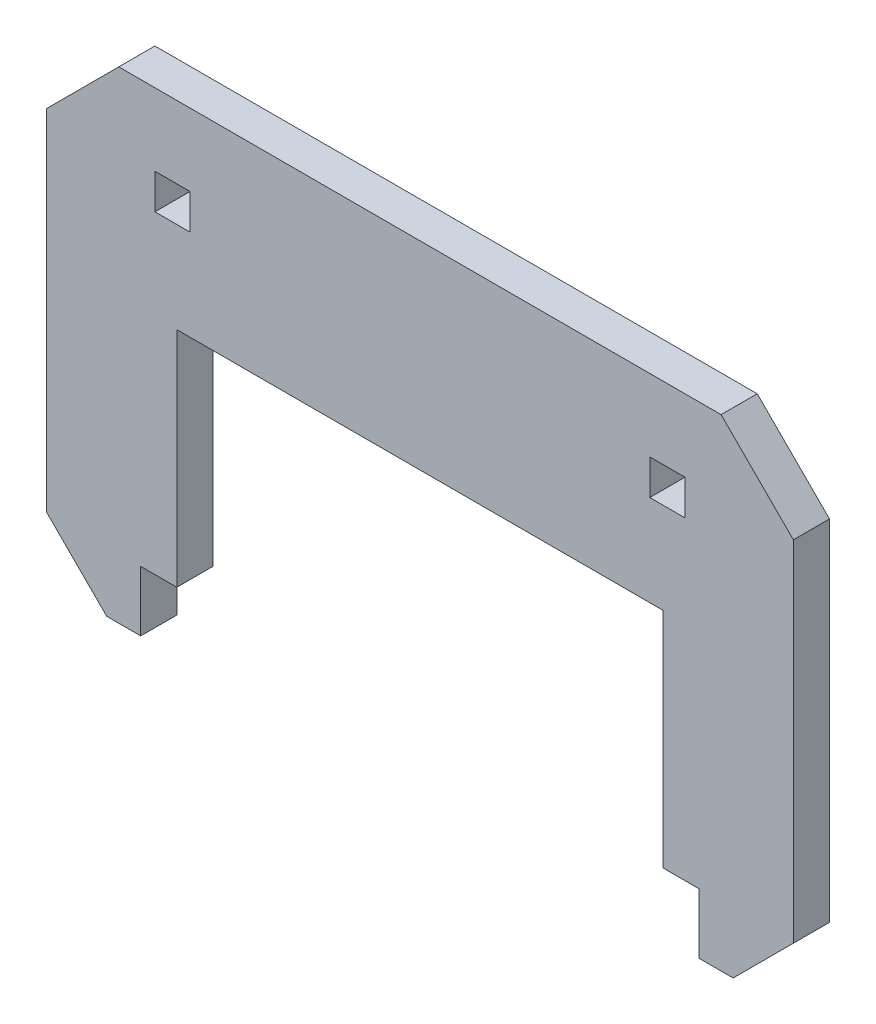
ISO-10303-21;
HEADER;
FILE_DESCRIPTION(('STEP AP214'),'2;1');
FILE_NAME('part.step','',(''),(''),'','','');
FILE_SCHEMA(('AUTOMOTIVE_DESIGN { 1 0 10303 214 1 1 1 1 }'));
ENDSEC;
DATA;
#1=APPLICATION_CONTEXT('core data for automotive mechanical design processes');
#2=APPLICATION_PROTOCOL_DEFINITION('international standard','automotive_design',2000,#1);
#3=PRODUCT_CONTEXT('',#1,'mechanical');
#4=PRODUCT('Part','Part','',(#3));
#5=PRODUCT_RELATED_PRODUCT_CATEGORY('part','',(#4));
#6=PRODUCT_DEFINITION_FORMATION('','',#4);
#7=PRODUCT_DEFINITION_CONTEXT('part definition',#1,'design');
#8=PRODUCT_DEFINITION('design','',#6,#7);
#9=PRODUCT_DEFINITION_SHAPE('','',#8);
#10=(LENGTH_UNIT() NAMED_UNIT(*) SI_UNIT(.MILLI.,.METRE.));
#11=(NAMED_UNIT(*) PLANE_ANGLE_UNIT() SI_UNIT($,.RADIAN.));
#12=(NAMED_UNIT(*) SI_UNIT($,.STERADIAN.) SOLID_ANGLE_UNIT());
#13=UNCERTAINTY_MEASURE_WITH_UNIT(LENGTH_MEASURE(1.E-05),#10,'distance_accuracy_value','');
#14=(GEOMETRIC_REPRESENTATION_CONTEXT(3) GLOBAL_UNCERTAINTY_ASSIGNED_CONTEXT((#13)) GLOBAL_UNIT_ASSIGNED_CONTEXT((#10,
#11,#12)) REPRESENTATION_CONTEXT('',''));
#15=CARTESIAN_POINT('',(0.,0.,0.));
#16=DIRECTION('',(0.,0.,1.));
#17=DIRECTION('',(1.,0.,0.));
#18=AXIS2_PLACEMENT_3D('',#15,#16,#17);
#19=CARTESIAN_POINT('',(-27.163730890987,-27.163730890987,3.));
#20=DIRECTION('',(0.707106781186548,0.707106781186547,0.));
#21=DIRECTION('',(-0.707106781186547,0.707106781186548,0.));
#22=AXIS2_PLACEMENT_3D('',#19,#20,#21);
#23=PLANE('',#22);
#24=DIRECTION('',(0.707106781186547,-0.707106781186548,0.));
#25=VECTOR('',#24,1.);
#26=CARTESIAN_POINT('',(-27.163730890987,-27.163730890987,0.));
#27=LINE('',#26,#25);
#28=CARTESIAN_POINT('',(-33.8654298148776,-20.4620319670965,0.));
#29=VERTEX_POINT('',#28);
#30=CARTESIAN_POINT('',(-28.8654298148776,-25.4620319670965,0.));
#31=VERTEX_POINT('',#30);
#32=EDGE_CURVE('E258',#29,#31,#27,.T.);
#33=ORIENTED_EDGE('',*,*,#32,.T.);
#34=DIRECTION('',(0.,0.,-1.));
#35=VECTOR('',#34,1.);
#36=CARTESIAN_POINT('',(-28.8654298148776,-25.4620319670965,3.));
#37=LINE('',#36,#35);
#38=CARTESIAN_POINT('',(-28.8654298148776,-25.4620319670965,3.));
#39=VERTEX_POINT('',#38);
#40=EDGE_CURVE('E11',#39,#31,#37,.T.);
#41=ORIENTED_EDGE('',*,*,#40,.F.);
#42=DIRECTION('',(0.707106781186547,-0.707106781186548,0.));
#43=VECTOR('',#42,1.);
#44=CARTESIAN_POINT('',(-27.163730890987,-27.163730890987,3.));
#45=LINE('',#44,#43);
#46=CARTESIAN_POINT('',(-33.8654298148776,-20.4620319670965,3.));
#47=VERTEX_POINT('',#46);
#48=EDGE_CURVE('E495',#47,#39,#45,.T.);
#49=ORIENTED_EDGE('',*,*,#48,.F.);
#50=DIRECTION('',(0.,0.,-1.));
#51=VECTOR('',#50,1.);
#52=CARTESIAN_POINT('',(-33.8654298148776,-20.4620319670965,3.));
#53=LINE('',#52,#51);
#54=EDGE_CURVE('E297',#47,#29,#53,.T.);
#55=ORIENTED_EDGE('',*,*,#54,.T.);
#56=EDGE_LOOP('',(#33,#41,#49,#55));
#57=FACE_BOUND('',#56,.T.);
#58=ADVANCED_FACE('F35',(#57),#23,.F.);
#59=CARTESIAN_POINT('',(0.,-25.4620319670965,3.));
#60=DIRECTION('',(0.,1.,0.));
#61=DIRECTION('',(0.,0.,1.));
#62=AXIS2_PLACEMENT_3D('',#59,#60,#61);
#63=PLANE('',#62);
#64=DIRECTION('',(1.,0.,0.));
#65=VECTOR('',#64,1.);
#66=CARTESIAN_POINT('',(0.,-25.4620319670965,0.));
#67=LINE('',#66,#65);
#68=CARTESIAN_POINT('',(-26.0454298148776,-25.4620319670965,0.));
#69=VERTEX_POINT('',#68);
#70=EDGE_CURVE('E261',#31,#69,#67,.T.);
#71=ORIENTED_EDGE('',*,*,#70,.T.);
#72=DIRECTION('',(0.,0.,-1.));
#73=VECTOR('',#72,1.);
#74=CARTESIAN_POINT('',(-26.0454298148776,-25.4620319670965,3.));
#75=LINE('',#74,#73);
#76=CARTESIAN_POINT('',(-26.0454298148776,-25.4620319670965,3.));
#77=VERTEX_POINT('',#76);
#78=EDGE_CURVE('E45',#77,#69,#75,.T.);
#79=ORIENTED_EDGE('',*,*,#78,.F.);
#80=DIRECTION('',(1.,0.,0.));
#81=VECTOR('',#80,1.);
#82=CARTESIAN_POINT('',(0.,-25.4620319670965,3.));
#83=LINE('',#82,#81);
#84=EDGE_CURVE('E496',#39,#77,#83,.T.);
#85=ORIENTED_EDGE('',*,*,#84,.F.);
#86=ORIENTED_EDGE('',*,*,#40,.T.);
#87=EDGE_LOOP('',(#71,#79,#85,#86));
#88=FACE_BOUND('',#87,.T.);
#89=ADVANCED_FACE('F368',(#88),#63,.F.);
#90=CARTESIAN_POINT('',(-26.0454298148776,0.,3.));
#91=DIRECTION('',(-1.,0.,0.));
#92=DIRECTION('',(0.,0.,1.));
#93=AXIS2_PLACEMENT_3D('',#90,#91,#92);
#94=PLANE('',#93);
#95=DIRECTION('',(0.,1.,0.));
#96=VECTOR('',#95,1.);
#97=CARTESIAN_POINT('',(-26.0454298148776,0.,0.));
#98=LINE('',#97,#96);
#99=CARTESIAN_POINT('',(-26.0454298148776,-20.4620319670965,0.));
#100=VERTEX_POINT('',#99);
#101=EDGE_CURVE('E263',#69,#100,#98,.T.);
#102=ORIENTED_EDGE('',*,*,#101,.T.);
#103=DIRECTION('',(0.,0.,-1.));
#104=VECTOR('',#103,1.);
#105=CARTESIAN_POINT('',(-26.0454298148776,-20.4620319670965,3.));
#106=LINE('',#105,#104);
#107=CARTESIAN_POINT('',(-26.0454298148776,-20.4620319670965,3.));
#108=VERTEX_POINT('',#107);
#109=EDGE_CURVE('E322',#108,#100,#106,.T.);
#110=ORIENTED_EDGE('',*,*,#109,.F.);
#111=DIRECTION('',(0.,1.,0.));
#112=VECTOR('',#111,1.);
#113=CARTESIAN_POINT('',(-26.0454298148776,0.,3.));
#114=LINE('',#113,#112);
#115=EDGE_CURVE('E499',#77,#108,#114,.T.);
#116=ORIENTED_EDGE('',*,*,#115,.F.);
#117=ORIENTED_EDGE('',*,*,#78,.T.);
#118=EDGE_LOOP('',(#102,#110,#116,#117));
#119=FACE_BOUND('',#118,.T.);
#120=ADVANCED_FACE('F374',(#119),#94,.F.);
#121=CARTESIAN_POINT('',(0.,-20.4620319670965,3.));
#122=DIRECTION('',(0.,1.,0.));
#123=DIRECTION('',(0.,0.,1.));
#124=AXIS2_PLACEMENT_3D('',#121,#122,#123);
#125=PLANE('',#124);
#126=DIRECTION('',(1.,0.,0.));
#127=VECTOR('',#126,1.);
#128=CARTESIAN_POINT('',(0.,-20.4620319670965,0.));
#129=LINE('',#128,#127);
#130=CARTESIAN_POINT('',(-23.0454298148776,-20.4620319670965,0.));
#131=VERTEX_POINT('',#130);
#132=EDGE_CURVE('E265',#100,#131,#129,.T.);
#133=ORIENTED_EDGE('',*,*,#132,.T.);
#134=DIRECTION('',(0.,0.,-1.));
#135=VECTOR('',#134,1.);
#136=CARTESIAN_POINT('',(-23.0454298148776,-20.4620319670965,3.));
#137=LINE('',#136,#135);
#138=CARTESIAN_POINT('',(-23.0454298148776,-20.4620319670965,3.));
#139=VERTEX_POINT('',#138);
#140=EDGE_CURVE('E319',#139,#131,#137,.T.);
#141=ORIENTED_EDGE('',*,*,#140,.F.);
#142=DIRECTION('',(1.,0.,0.));
#143=VECTOR('',#142,1.);
#144=CARTESIAN_POINT('',(0.,-20.4620319670965,3.));
#145=LINE('',#144,#143);
#146=EDGE_CURVE('E458',#108,#139,#145,.T.);
#147=ORIENTED_EDGE('',*,*,#146,.F.);
#148=ORIENTED_EDGE('',*,*,#109,.T.);
#149=EDGE_LOOP('',(#133,#141,#147,#148));
#150=FACE_BOUND('',#149,.T.);
#151=ADVANCED_FACE('F442',(#150),#125,.F.);
#152=CARTESIAN_POINT('',(-23.0454298148776,0.,3.));
#153=DIRECTION('',(-1.,0.,0.));
#154=DIRECTION('',(0.,0.,1.));
#155=AXIS2_PLACEMENT_3D('',#152,#153,#154);
#156=PLANE('',#155);
#157=DIRECTION('',(0.,1.,0.));
#158=VECTOR('',#157,1.);
#159=CARTESIAN_POINT('',(-23.0454298148776,0.,0.));
#160=LINE('',#159,#158);
#161=CARTESIAN_POINT('',(-23.0454298148776,-1.94203196709648,0.));
#162=VERTEX_POINT('',#161);
#163=EDGE_CURVE('E267',#131,#162,#160,.T.);
#164=ORIENTED_EDGE('',*,*,#163,.T.);
#165=DIRECTION('',(0.,0.,-1.));
#166=VECTOR('',#165,1.);
#167=CARTESIAN_POINT('',(-23.0454298148776,-1.94203196709648,3.));
#168=LINE('',#167,#166);
#169=CARTESIAN_POINT('',(-23.0454298148776,-1.94203196709648,3.));
#170=VERTEX_POINT('',#169);
#171=EDGE_CURVE('E316',#170,#162,#168,.T.);
#172=ORIENTED_EDGE('',*,*,#171,.F.);
#173=DIRECTION('',(0.,1.,0.));
#174=VECTOR('',#173,1.);
#175=CARTESIAN_POINT('',(-23.0454298148776,0.,3.));
#176=LINE('',#175,#174);
#177=EDGE_CURVE('E470',#139,#170,#176,.T.);
#178=ORIENTED_EDGE('',*,*,#177,.F.);
#179=ORIENTED_EDGE('',*,*,#140,.T.);
#180=EDGE_LOOP('',(#164,#172,#178,#179));
#181=FACE_BOUND('',#180,.T.);
#182=ADVANCED_FACE('F438',(#181),#156,.F.);
#183=CARTESIAN_POINT('',(0.,-1.94203196709648,3.));
#184=DIRECTION('',(0.,1.,0.));
#185=DIRECTION('',(0.,0.,1.));
#186=AXIS2_PLACEMENT_3D('',#183,#184,#185);
#187=PLANE('',#186);
#188=DIRECTION('',(1.,0.,0.));
#189=VECTOR('',#188,1.);
#190=CARTESIAN_POINT('',(0.,-1.94203196709648,0.));
#191=LINE('',#190,#189);
#192=CARTESIAN_POINT('',(17.3145701851224,-1.94203196709648,0.));
#193=VERTEX_POINT('',#192);
#194=EDGE_CURVE('E269',#162,#193,#191,.T.);
#195=ORIENTED_EDGE('',*,*,#194,.T.);
#196=DIRECTION('',(0.,0.,-1.));
#197=VECTOR('',#196,1.);
#198=CARTESIAN_POINT('',(17.3145701851224,-1.94203196709648,3.));
#199=LINE('',#198,#197);
#200=CARTESIAN_POINT('',(17.3145701851224,-1.94203196709648,3.));
#201=VERTEX_POINT('',#200);
#202=EDGE_CURVE('E314',#201,#193,#199,.T.);
#203=ORIENTED_EDGE('',*,*,#202,.F.);
#204=DIRECTION('',(1.,0.,0.));
#205=VECTOR('',#204,1.);
#206=CARTESIAN_POINT('',(0.,-1.94203196709648,3.));
#207=LINE('',#206,#205);
#208=EDGE_CURVE('E466',#170,#201,#207,.T.);
#209=ORIENTED_EDGE('',*,*,#208,.F.);
#210=ORIENTED_EDGE('',*,*,#171,.T.);
#211=EDGE_LOOP('',(#195,#203,#209,#210));
#212=FACE_BOUND('',#211,.T.);
#213=ADVANCED_FACE('F434',(#212),#187,.F.);
#214=CARTESIAN_POINT('',(17.3145701851224,0.,3.));
#215=DIRECTION('',(-1.,0.,0.));
#216=DIRECTION('',(0.,0.,1.));
#217=AXIS2_PLACEMENT_3D('',#214,#215,#216);
#218=PLANE('',#217);
#219=DIRECTION('',(0.,1.,0.));
#220=VECTOR('',#219,1.);
#221=CARTESIAN_POINT('',(17.3145701851224,0.,0.));
#222=LINE('',#221,#220);
#223=CARTESIAN_POINT('',(17.3145701851224,-20.4620319670965,0.));
#224=VERTEX_POINT('',#223);
#225=EDGE_CURVE('E272',#224,#193,#222,.T.);
#226=ORIENTED_EDGE('',*,*,#225,.F.);
#227=DIRECTION('',(0.,0.,-1.));
#228=VECTOR('',#227,1.);
#229=CARTESIAN_POINT('',(17.3145701851224,-20.4620319670965,3.));
#230=LINE('',#229,#228);
#231=CARTESIAN_POINT('',(17.3145701851224,-20.4620319670965,3.));
#232=VERTEX_POINT('',#231);
#233=EDGE_CURVE('E312',#232,#224,#230,.T.);
#234=ORIENTED_EDGE('',*,*,#233,.F.);
#235=DIRECTION('',(0.,1.,0.));
#236=VECTOR('',#235,1.);
#237=CARTESIAN_POINT('',(17.3145701851224,0.,3.));
#238=LINE('',#237,#236);
#239=EDGE_CURVE('E469',#232,#201,#238,.T.);
#240=ORIENTED_EDGE('',*,*,#239,.T.);
#241=ORIENTED_EDGE('',*,*,#202,.T.);
#242=EDGE_LOOP('',(#226,#234,#240,#241));
#243=FACE_BOUND('',#242,.T.);
#244=ADVANCED_FACE('F430',(#243),#218,.T.);
#245=CARTESIAN_POINT('',(0.,-20.4620319670965,3.));
#246=DIRECTION('',(0.,-1.,0.));
#247=DIRECTION('',(0.,0.,-1.));
#248=AXIS2_PLACEMENT_3D('',#245,#246,#247);
#249=PLANE('',#248);
#250=DIRECTION('',(-1.,0.,0.));
#251=VECTOR('',#250,1.);
#252=CARTESIAN_POINT('',(0.,-20.4620319670965,0.));
#253=LINE('',#252,#251);
#254=CARTESIAN_POINT('',(20.3145701851224,-20.4620319670965,0.));
#255=VERTEX_POINT('',#254);
#256=EDGE_CURVE('E275',#255,#224,#253,.T.);
#257=ORIENTED_EDGE('',*,*,#256,.F.);
#258=DIRECTION('',(0.,0.,-1.));
#259=VECTOR('',#258,1.);
#260=CARTESIAN_POINT('',(20.3145701851224,-20.4620319670965,3.));
#261=LINE('',#260,#259);
#262=CARTESIAN_POINT('',(20.3145701851224,-20.4620319670965,3.));
#263=VERTEX_POINT('',#262);
#264=EDGE_CURVE('E310',#263,#255,#261,.T.);
#265=ORIENTED_EDGE('',*,*,#264,.F.);
#266=DIRECTION('',(-1.,0.,0.));
#267=VECTOR('',#266,1.);
#268=CARTESIAN_POINT('',(0.,-20.4620319670965,3.));
#269=LINE('',#268,#267);
#270=EDGE_CURVE('E472',#263,#232,#269,.T.);
#271=ORIENTED_EDGE('',*,*,#270,.T.);
#272=ORIENTED_EDGE('',*,*,#233,.T.);
#273=EDGE_LOOP('',(#257,#265,#271,#272));
#274=FACE_BOUND('',#273,.T.);
#275=ADVANCED_FACE('F426',(#274),#249,.T.);
#276=CARTESIAN_POINT('',(20.3145701851224,0.,3.));
#277=DIRECTION('',(-1.,0.,0.));
#278=DIRECTION('',(0.,0.,1.));
#279=AXIS2_PLACEMENT_3D('',#276,#277,#278);
#280=PLANE('',#279);
#281=DIRECTION('',(0.,1.,0.));
#282=VECTOR('',#281,1.);
#283=CARTESIAN_POINT('',(20.3145701851224,0.,0.));
#284=LINE('',#283,#282);
#285=CARTESIAN_POINT('',(20.3145701851224,-25.4620319670965,0.));
#286=VERTEX_POINT('',#285);
#287=EDGE_CURVE('E278',#286,#255,#284,.T.);
#288=ORIENTED_EDGE('',*,*,#287,.F.);
#289=DIRECTION('',(0.,0.,-1.));
#290=VECTOR('',#289,1.);
#291=CARTESIAN_POINT('',(20.3145701851224,-25.4620319670965,3.));
#292=LINE('',#291,#290);
#293=CARTESIAN_POINT('',(20.3145701851224,-25.4620319670965,3.));
#294=VERTEX_POINT('',#293);
#295=EDGE_CURVE('E308',#294,#286,#292,.T.);
#296=ORIENTED_EDGE('',*,*,#295,.F.);
#297=DIRECTION('',(0.,1.,0.));
#298=VECTOR('',#297,1.);
#299=CARTESIAN_POINT('',(20.3145701851224,0.,3.));
#300=LINE('',#299,#298);
#301=EDGE_CURVE('E479',#294,#263,#300,.T.);
#302=ORIENTED_EDGE('',*,*,#301,.T.);
#303=ORIENTED_EDGE('',*,*,#264,.T.);
#304=EDGE_LOOP('',(#288,#296,#302,#303));
#305=FACE_BOUND('',#304,.T.);
#306=ADVANCED_FACE('F422',(#305),#280,.T.);
#307=CARTESIAN_POINT('',(0.,-25.4620319670965,3.));
#308=DIRECTION('',(0.,-1.,0.));
#309=DIRECTION('',(0.,0.,-1.));
#310=AXIS2_PLACEMENT_3D('',#307,#308,#309);
#311=PLANE('',#310);
#312=DIRECTION('',(-1.,0.,0.));
#313=VECTOR('',#312,1.);
#314=CARTESIAN_POINT('',(0.,-25.4620319670965,0.));
#315=LINE('',#314,#313);
#316=CARTESIAN_POINT('',(23.1345701851224,-25.4620319670965,0.));
#317=VERTEX_POINT('',#316);
#318=EDGE_CURVE('E281',#317,#286,#315,.T.);
#319=ORIENTED_EDGE('',*,*,#318,.F.);
#320=DIRECTION('',(0.,0.,-1.));
#321=VECTOR('',#320,1.);
#322=CARTESIAN_POINT('',(23.1345701851224,-25.4620319670965,3.));
#323=LINE('',#322,#321);
#324=CARTESIAN_POINT('',(23.1345701851224,-25.4620319670965,3.));
#325=VERTEX_POINT('',#324);
#326=EDGE_CURVE('E306',#325,#317,#323,.T.);
#327=ORIENTED_EDGE('',*,*,#326,.F.);
#328=DIRECTION('',(-1.,0.,0.));
#329=VECTOR('',#328,1.);
#330=CARTESIAN_POINT('',(0.,-25.4620319670965,3.));
#331=LINE('',#330,#329);
#332=EDGE_CURVE('E482',#325,#294,#331,.T.);
#333=ORIENTED_EDGE('',*,*,#332,.T.);
#334=ORIENTED_EDGE('',*,*,#295,.T.);
#335=EDGE_LOOP('',(#319,#327,#333,#334));
#336=FACE_BOUND('',#335,.T.);
#337=ADVANCED_FACE('F418',(#336),#311,.T.);
#338=CARTESIAN_POINT('',(24.2983010761095,-24.2983010761095,3.));
#339=DIRECTION('',(0.707106781186547,-0.707106781186547,0.));
#340=DIRECTION('',(0.707106781186548,0.707106781186548,0.));
#341=AXIS2_PLACEMENT_3D('',#338,#339,#340);
#342=PLANE('',#341);
#343=DIRECTION('',(-0.707106781186548,-0.707106781186548,0.));
#344=VECTOR('',#343,1.);
#345=CARTESIAN_POINT('',(24.2983010761095,-24.2983010761095,0.));
#346=LINE('',#345,#344);
#347=CARTESIAN_POINT('',(28.1345701851224,-20.4620319670965,0.));
#348=VERTEX_POINT('',#347);
#349=EDGE_CURVE('E284',#348,#317,#346,.T.);
#350=ORIENTED_EDGE('',*,*,#349,.F.);
#351=DIRECTION('',(0.,0.,-1.));
#352=VECTOR('',#351,1.);
#353=CARTESIAN_POINT('',(28.1345701851224,-20.4620319670965,3.));
#354=LINE('',#353,#352);
#355=CARTESIAN_POINT('',(28.1345701851224,-20.4620319670965,3.));
#356=VERTEX_POINT('',#355);
#357=EDGE_CURVE('E304',#356,#348,#354,.T.);
#358=ORIENTED_EDGE('',*,*,#357,.F.);
#359=DIRECTION('',(-0.707106781186548,-0.707106781186548,0.));
#360=VECTOR('',#359,1.);
#361=CARTESIAN_POINT('',(24.2983010761095,-24.2983010761095,3.));
#362=LINE('',#361,#360);
#363=EDGE_CURVE('E485',#356,#325,#362,.T.);
#364=ORIENTED_EDGE('',*,*,#363,.T.);
#365=ORIENTED_EDGE('',*,*,#326,.T.);
#366=EDGE_LOOP('',(#350,#358,#364,#365));
#367=FACE_BOUND('',#366,.T.);
#368=ADVANCED_FACE('F414',(#367),#342,.T.);
#369=CARTESIAN_POINT('',(28.1345701851224,0.,3.));
#370=DIRECTION('',(1.,0.,0.));
#371=DIRECTION('',(0.,1.,0.));
#372=AXIS2_PLACEMENT_3D('',#369,#370,#371);
#373=PLANE('',#372);
#374=DIRECTION('',(0.,-1.,0.));
#375=VECTOR('',#374,1.);
#376=CARTESIAN_POINT('',(28.1345701851224,0.,0.));
#377=LINE('',#376,#375);
#378=CARTESIAN_POINT('',(28.1345701851224,8.53796803290352,0.));
#379=VERTEX_POINT('',#378);
#380=EDGE_CURVE('E287',#379,#348,#377,.T.);
#381=ORIENTED_EDGE('',*,*,#380,.F.);
#382=DIRECTION('',(0.,0.,-1.));
#383=VECTOR('',#382,1.);
#384=CARTESIAN_POINT('',(28.1345701851224,8.53796803290352,3.));
#385=LINE('',#384,#383);
#386=CARTESIAN_POINT('',(28.1345701851224,8.53796803290352,3.));
#387=VERTEX_POINT('',#386);
#388=EDGE_CURVE('E302',#387,#379,#385,.T.);
#389=ORIENTED_EDGE('',*,*,#388,.F.);
#390=DIRECTION('',(0.,-1.,0.));
#391=VECTOR('',#390,1.);
#392=CARTESIAN_POINT('',(28.1345701851224,0.,3.));
#393=LINE('',#392,#391);
#394=EDGE_CURVE('E228',#387,#356,#393,.T.);
#395=ORIENTED_EDGE('',*,*,#394,.T.);
#396=ORIENTED_EDGE('',*,*,#357,.T.);
#397=EDGE_LOOP('',(#381,#389,#395,#396));
#398=FACE_BOUND('',#397,.T.);
#399=ADVANCED_FACE('F410',(#398),#373,.T.);
#400=CARTESIAN_POINT('',(18.336269109013,18.336269109013,3.));
#401=DIRECTION('',(0.707106781186548,0.707106781186547,0.));
#402=DIRECTION('',(-0.707106781186547,0.707106781186548,0.));
#403=AXIS2_PLACEMENT_3D('',#400,#401,#402);
#404=PLANE('',#403);
#405=DIRECTION('',(0.707106781186547,-0.707106781186548,0.));
#406=VECTOR('',#405,1.);
#407=CARTESIAN_POINT('',(18.336269109013,18.336269109013,0.));
#408=LINE('',#407,#406);
#409=CARTESIAN_POINT('',(22.1345701851224,14.5379680329035,0.));
#410=VERTEX_POINT('',#409);
#411=EDGE_CURVE('E290',#410,#379,#408,.T.);
#412=ORIENTED_EDGE('',*,*,#411,.F.);
#413=DIRECTION('',(0.,0.,-1.));
#414=VECTOR('',#413,1.);
#415=CARTESIAN_POINT('',(22.1345701851224,14.5379680329035,3.));
#416=LINE('',#415,#414);
#417=CARTESIAN_POINT('',(22.1345701851224,14.5379680329035,3.));
#418=VERTEX_POINT('',#417);
#419=EDGE_CURVE('E216',#418,#410,#416,.T.);
#420=ORIENTED_EDGE('',*,*,#419,.F.);
#421=DIRECTION('',(0.707106781186547,-0.707106781186548,0.));
#422=VECTOR('',#421,1.);
#423=CARTESIAN_POINT('',(18.336269109013,18.336269109013,3.));
#424=LINE('',#423,#422);
#425=EDGE_CURVE('E226',#418,#387,#424,.T.);
#426=ORIENTED_EDGE('',*,*,#425,.T.);
#427=ORIENTED_EDGE('',*,*,#388,.T.);
#428=EDGE_LOOP('',(#412,#420,#426,#427));
#429=FACE_BOUND('',#428,.T.);
#430=ADVANCED_FACE('F407',(#429),#404,.T.);
#431=CARTESIAN_POINT('',(0.,14.5379680329035,3.));
#432=DIRECTION('',(0.,1.,0.));
#433=DIRECTION('',(0.,0.,1.));
#434=AXIS2_PLACEMENT_3D('',#431,#432,#433);
#435=PLANE('',#434);
#436=DIRECTION('',(1.,0.,0.));
#437=VECTOR('',#436,1.);
#438=CARTESIAN_POINT('',(0.,14.5379680329035,0.));
#439=LINE('',#438,#437);
#440=CARTESIAN_POINT('',(-27.8654298148776,14.5379680329035,0.));
#441=VERTEX_POINT('',#440);
#442=EDGE_CURVE('E215',#441,#410,#439,.T.);
#443=ORIENTED_EDGE('',*,*,#442,.F.);
#444=DIRECTION('',(0.,0.,-1.));
#445=VECTOR('',#444,1.);
#446=CARTESIAN_POINT('',(-27.8654298148776,14.5379680329035,3.));
#447=LINE('',#446,#445);
#448=CARTESIAN_POINT('',(-27.8654298148776,14.5379680329035,3.));
#449=VERTEX_POINT('',#448);
#450=EDGE_CURVE('E209',#449,#441,#447,.T.);
#451=ORIENTED_EDGE('',*,*,#450,.F.);
#452=DIRECTION('',(1.,0.,0.));
#453=VECTOR('',#452,1.);
#454=CARTESIAN_POINT('',(0.,14.5379680329035,3.));
#455=LINE('',#454,#453);
#456=EDGE_CURVE('E213',#449,#418,#455,.T.);
#457=ORIENTED_EDGE('',*,*,#456,.T.);
#458=ORIENTED_EDGE('',*,*,#419,.T.);
#459=EDGE_LOOP('',(#443,#451,#457,#458));
#460=FACE_BOUND('',#459,.T.);
#461=ADVANCED_FACE('F211',(#460),#435,.T.);
#462=CARTESIAN_POINT('',(-21.2016989238906,21.2016989238906,3.));
#463=DIRECTION('',(0.707106781186548,-0.707106781186547,0.));
#464=DIRECTION('',(0.707106781186547,0.707106781186548,0.));
#465=AXIS2_PLACEMENT_3D('',#462,#463,#464);
#466=PLANE('',#465);
#467=DIRECTION('',(-0.707106781186547,-0.707106781186548,0.));
#468=VECTOR('',#467,1.);
#469=CARTESIAN_POINT('',(-21.2016989238906,21.2016989238906,0.));
#470=LINE('',#469,#468);
#471=CARTESIAN_POINT('',(-33.8654298148776,8.53796803290352,0.));
#472=VERTEX_POINT('',#471);
#473=EDGE_CURVE('E130',#441,#472,#470,.T.);
#474=ORIENTED_EDGE('',*,*,#473,.T.);
#475=DIRECTION('',(0.,0.,-1.));
#476=VECTOR('',#475,1.);
#477=CARTESIAN_POINT('',(-33.8654298148776,8.53796803290352,3.));
#478=LINE('',#477,#476);
#479=CARTESIAN_POINT('',(-33.8654298148776,8.53796803290352,3.));
#480=VERTEX_POINT('',#479);
#481=EDGE_CURVE('E217',#480,#472,#478,.T.);
#482=ORIENTED_EDGE('',*,*,#481,.F.);
#483=DIRECTION('',(-0.707106781186547,-0.707106781186548,0.));
#484=VECTOR('',#483,1.);
#485=CARTESIAN_POINT('',(-21.2016989238906,21.2016989238906,3.));
#486=LINE('',#485,#484);
#487=EDGE_CURVE('E219',#449,#480,#486,.T.);
#488=ORIENTED_EDGE('',*,*,#487,.F.);
#489=ORIENTED_EDGE('',*,*,#450,.T.);
#490=EDGE_LOOP('',(#474,#482,#488,#489));
#491=FACE_BOUND('',#490,.T.);
#492=ADVANCED_FACE('F220',(#491),#466,.F.);
#493=CARTESIAN_POINT('',(0.,8.5379680329035,3.));
#494=DIRECTION('',(0.,-1.,0.));
#495=DIRECTION('',(1.,0.,0.));
#496=AXIS2_PLACEMENT_3D('',#493,#494,#495);
#497=PLANE('',#496);
#498=DIRECTION('',(-1.,0.,0.));
#499=VECTOR('',#498,1.);
#500=CARTESIAN_POINT('',(0.,8.5379680329035,0.));
#501=LINE('',#500,#499);
#502=CARTESIAN_POINT('',(-21.9454298148776,8.53796803290352,0.));
#503=VERTEX_POINT('',#502);
#504=CARTESIAN_POINT('',(-24.8654298148776,8.53796803290352,0.));
#505=VERTEX_POINT('',#504);
#506=EDGE_CURVE('E246',#503,#505,#501,.T.);
#507=ORIENTED_EDGE('',*,*,#506,.F.);
#508=DIRECTION('',(0.,0.,-1.));
#509=VECTOR('',#508,1.);
#510=CARTESIAN_POINT('',(-21.9454298148776,8.53796803290352,3.));
#511=LINE('',#510,#509);
#512=CARTESIAN_POINT('',(-21.9454298148776,8.53796803290352,3.));
#513=VERTEX_POINT('',#512);
#514=EDGE_CURVE('E299',#513,#503,#511,.T.);
#515=ORIENTED_EDGE('',*,*,#514,.F.);
#516=DIRECTION('',(-1.,0.,0.));
#517=VECTOR('',#516,1.);
#518=CARTESIAN_POINT('',(0.,8.5379680329035,3.));
#519=LINE('',#518,#517);
#520=CARTESIAN_POINT('',(-24.8654298148776,8.53796803290352,3.));
#521=VERTEX_POINT('',#520);
#522=EDGE_CURVE('E510',#513,#521,#519,.T.);
#523=ORIENTED_EDGE('',*,*,#522,.T.);
#524=DIRECTION('',(0.,0.,-1.));
#525=VECTOR('',#524,1.);
#526=CARTESIAN_POINT('',(-24.8654298148776,8.53796803290352,3.));
#527=LINE('',#526,#525);
#528=EDGE_CURVE('E327',#521,#505,#527,.T.);
#529=ORIENTED_EDGE('',*,*,#528,.T.);
#530=EDGE_LOOP('',(#507,#515,#523,#529));
#531=FACE_BOUND('',#530,.T.);
#532=ADVANCED_FACE('F386',(#531),#497,.T.);
#533=CARTESIAN_POINT('',(-21.9454298148776,0.,3.));
#534=DIRECTION('',(1.,0.,0.));
#535=DIRECTION('',(0.,0.,-1.));
#536=AXIS2_PLACEMENT_3D('',#533,#534,#535);
#537=PLANE('',#536);
#538=DIRECTION('',(0.,-1.,0.));
#539=VECTOR('',#538,1.);
#540=CARTESIAN_POINT('',(-21.9454298148776,0.,0.));
#541=LINE('',#540,#539);
#542=CARTESIAN_POINT('',(-21.9454298148776,5.61796803290352,0.));
#543=VERTEX_POINT('',#542);
#544=EDGE_CURVE('E249',#503,#543,#541,.T.);
#545=ORIENTED_EDGE('',*,*,#544,.T.);
#546=DIRECTION('',(0.,0.,-1.));
#547=VECTOR('',#546,1.);
#548=CARTESIAN_POINT('',(-21.9454298148776,5.61796803290352,3.));
#549=LINE('',#548,#547);
#550=CARTESIAN_POINT('',(-21.9454298148776,5.61796803290352,3.));
#551=VERTEX_POINT('',#550);
#552=EDGE_CURVE('E331',#551,#543,#549,.T.);
#553=ORIENTED_EDGE('',*,*,#552,.F.);
#554=DIRECTION('',(0.,-1.,0.));
#555=VECTOR('',#554,1.);
#556=CARTESIAN_POINT('',(-21.9454298148776,0.,3.));
#557=LINE('',#556,#555);
#558=EDGE_CURVE('E507',#513,#551,#557,.T.);
#559=ORIENTED_EDGE('',*,*,#558,.F.);
#560=ORIENTED_EDGE('',*,*,#514,.T.);
#561=EDGE_LOOP('',(#545,#553,#559,#560));
#562=FACE_BOUND('',#561,.T.);
#563=ADVANCED_FACE('F382',(#562),#537,.F.);
#564=CARTESIAN_POINT('',(0.,5.61796803290352,3.));
#565=DIRECTION('',(0.,-1.,0.));
#566=DIRECTION('',(0.,0.,-1.));
#567=AXIS2_PLACEMENT_3D('',#564,#565,#566);
#568=PLANE('',#567);
#569=DIRECTION('',(-1.,0.,0.));
#570=VECTOR('',#569,1.);
#571=CARTESIAN_POINT('',(0.,5.61796803290352,0.));
#572=LINE('',#571,#570);
#573=CARTESIAN_POINT('',(-24.8654298148776,5.61796803290352,0.));
#574=VERTEX_POINT('',#573);
#575=EDGE_CURVE('E252',#543,#574,#572,.T.);
#576=ORIENTED_EDGE('',*,*,#575,.T.);
#577=DIRECTION('',(0.,0.,-1.));
#578=VECTOR('',#577,1.);
#579=CARTESIAN_POINT('',(-24.8654298148776,5.61796803290352,3.));
#580=LINE('',#579,#578);
#581=CARTESIAN_POINT('',(-24.8654298148776,5.61796803290352,3.));
#582=VERTEX_POINT('',#581);
#583=EDGE_CURVE('E329',#582,#574,#580,.T.);
#584=ORIENTED_EDGE('',*,*,#583,.F.);
#585=DIRECTION('',(-1.,0.,0.));
#586=VECTOR('',#585,1.);
#587=CARTESIAN_POINT('',(0.,5.61796803290352,3.));
#588=LINE('',#587,#586);
#589=EDGE_CURVE('E502',#551,#582,#588,.T.);
#590=ORIENTED_EDGE('',*,*,#589,.F.);
#591=ORIENTED_EDGE('',*,*,#552,.T.);
#592=EDGE_LOOP('',(#576,#584,#590,#591));
#593=FACE_BOUND('',#592,.T.);
#594=ADVANCED_FACE('F379',(#593),#568,.F.);
#595=CARTESIAN_POINT('',(0.,8.53796803290351,3.));
#596=DIRECTION('',(0.,1.,0.));
#597=DIRECTION('',(-1.,0.,0.));
#598=AXIS2_PLACEMENT_3D('',#595,#596,#597);
#599=PLANE('',#598);
#600=DIRECTION('',(1.,0.,0.));
#601=VECTOR('',#600,1.);
#602=CARTESIAN_POINT('',(0.,8.53796803290351,0.));
#603=LINE('',#602,#601);
#604=CARTESIAN_POINT('',(16.2145701851224,8.53796803290352,0.));
#605=VERTEX_POINT('',#604);
#606=CARTESIAN_POINT('',(19.1345701851224,8.53796803290352,0.));
#607=VERTEX_POINT('',#606);
#608=EDGE_CURVE('E234',#605,#607,#603,.T.);
#609=ORIENTED_EDGE('',*,*,#608,.T.);
#610=DIRECTION('',(0.,0.,-1.));
#611=VECTOR('',#610,1.);
#612=CARTESIAN_POINT('',(19.1345701851224,8.53796803290352,3.));
#613=LINE('',#612,#611);
#614=CARTESIAN_POINT('',(19.1345701851224,8.53796803290352,3.));
#615=VERTEX_POINT('',#614);
#616=EDGE_CURVE('E39',#615,#607,#613,.T.);
#617=ORIENTED_EDGE('',*,*,#616,.F.);
#618=DIRECTION('',(1.,0.,0.));
#619=VECTOR('',#618,1.);
#620=CARTESIAN_POINT('',(0.,8.53796803290351,3.));
#621=LINE('',#620,#619);
#622=CARTESIAN_POINT('',(16.2145701851224,8.53796803290352,3.));
#623=VERTEX_POINT('',#622);
#624=EDGE_CURVE('E296',#623,#615,#621,.T.);
#625=ORIENTED_EDGE('',*,*,#624,.F.);
#626=DIRECTION('',(0.,0.,-1.));
#627=VECTOR('',#626,1.);
#628=CARTESIAN_POINT('',(16.2145701851224,8.53796803290352,3.));
#629=LINE('',#628,#627);
#630=EDGE_CURVE('E233',#623,#605,#629,.T.);
#631=ORIENTED_EDGE('',*,*,#630,.T.);
#632=EDGE_LOOP('',(#609,#617,#625,#631));
#633=FACE_BOUND('',#632,.T.);
#634=ADVANCED_FACE('F37',(#633),#599,.F.);
#635=CARTESIAN_POINT('',(19.1345701851224,0.,3.));
#636=DIRECTION('',(1.,0.,0.));
#637=DIRECTION('',(0.,1.,0.));
#638=AXIS2_PLACEMENT_3D('',#635,#636,#637);
#639=PLANE('',#638);
#640=DIRECTION('',(0.,-1.,0.));
#641=VECTOR('',#640,1.);
#642=CARTESIAN_POINT('',(19.1345701851224,0.,0.));
#643=LINE('',#642,#641);
#644=CARTESIAN_POINT('',(19.1345701851224,5.61796803290352,0.));
#645=VERTEX_POINT('',#644);
#646=EDGE_CURVE('E237',#607,#645,#643,.T.);
#647=ORIENTED_EDGE('',*,*,#646,.T.);
#648=DIRECTION('',(0.,0.,-1.));
#649=VECTOR('',#648,1.);
#650=CARTESIAN_POINT('',(19.1345701851224,5.61796803290352,3.));
#651=LINE('',#650,#649);
#652=CARTESIAN_POINT('',(19.1345701851224,5.61796803290352,3.));
#653=VERTEX_POINT('',#652);
#654=EDGE_CURVE('E337',#653,#645,#651,.T.);
#655=ORIENTED_EDGE('',*,*,#654,.F.);
#656=DIRECTION('',(0.,-1.,0.));
#657=VECTOR('',#656,1.);
#658=CARTESIAN_POINT('',(19.1345701851224,0.,3.));
#659=LINE('',#658,#657);
#660=EDGE_CURVE('E145',#615,#653,#659,.T.);
#661=ORIENTED_EDGE('',*,*,#660,.F.);
#662=ORIENTED_EDGE('',*,*,#616,.T.);
#663=EDGE_LOOP('',(#647,#655,#661,#662));
#664=FACE_BOUND('',#663,.T.);
#665=ADVANCED_FACE('F342',(#664),#639,.F.);
#666=CARTESIAN_POINT('',(0.,5.61796803290352,3.));
#667=DIRECTION('',(0.,1.,0.));
#668=DIRECTION('',(0.,0.,1.));
#669=AXIS2_PLACEMENT_3D('',#666,#667,#668);
#670=PLANE('',#669);
#671=DIRECTION('',(1.,0.,0.));
#672=VECTOR('',#671,1.);
#673=CARTESIAN_POINT('',(0.,5.61796803290352,0.));
#674=LINE('',#673,#672);
#675=CARTESIAN_POINT('',(16.2145701851224,5.61796803290352,0.));
#676=VERTEX_POINT('',#675);
#677=EDGE_CURVE('E240',#676,#645,#674,.T.);
#678=ORIENTED_EDGE('',*,*,#677,.F.);
#679=DIRECTION('',(0.,0.,-1.));
#680=VECTOR('',#679,1.);
#681=CARTESIAN_POINT('',(16.2145701851224,5.61796803290352,3.));
#682=LINE('',#681,#680);
#683=CARTESIAN_POINT('',(16.2145701851224,5.61796803290352,3.));
#684=VERTEX_POINT('',#683);
#685=EDGE_CURVE('E336',#684,#676,#682,.T.);
#686=ORIENTED_EDGE('',*,*,#685,.F.);
#687=DIRECTION('',(1.,0.,0.));
#688=VECTOR('',#687,1.);
#689=CARTESIAN_POINT('',(0.,5.61796803290352,3.));
#690=LINE('',#689,#688);
#691=EDGE_CURVE('E514',#684,#653,#690,.T.);
#692=ORIENTED_EDGE('',*,*,#691,.T.);
#693=ORIENTED_EDGE('',*,*,#654,.T.);
#694=EDGE_LOOP('',(#678,#686,#692,#693));
#695=FACE_BOUND('',#694,.T.);
#696=ADVANCED_FACE('F356',(#695),#670,.T.);
#697=CARTESIAN_POINT('',(-24.8654298148776,0.,3.));
#698=DIRECTION('',(1.,0.,0.));
#699=DIRECTION('',(0.,1.,0.));
#700=AXIS2_PLACEMENT_3D('',#697,#698,#699);
#701=PLANE('',#700);
#702=DIRECTION('',(0.,-1.,0.));
#703=VECTOR('',#702,1.);
#704=CARTESIAN_POINT('',(-24.8654298148776,0.,0.));
#705=LINE('',#704,#703);
#706=EDGE_CURVE('E255',#505,#574,#705,.T.);
#707=ORIENTED_EDGE('',*,*,#706,.F.);
#708=ORIENTED_EDGE('',*,*,#528,.F.);
#709=DIRECTION('',(0.,-1.,0.));
#710=VECTOR('',#709,1.);
#711=CARTESIAN_POINT('',(-24.8654298148776,0.,3.));
#712=LINE('',#711,#710);
#713=EDGE_CURVE('E497',#521,#582,#712,.T.);
#714=ORIENTED_EDGE('',*,*,#713,.T.);
#715=ORIENTED_EDGE('',*,*,#583,.T.);
#716=EDGE_LOOP('',(#707,#708,#714,#715));
#717=FACE_BOUND('',#716,.T.);
#718=ADVANCED_FACE('F358',(#717),#701,.T.);
#719=CARTESIAN_POINT('',(16.2145701851224,0.,3.));
#720=DIRECTION('',(1.,0.,0.));
#721=DIRECTION('',(0.,0.,-1.));
#722=AXIS2_PLACEMENT_3D('',#719,#720,#721);
#723=PLANE('',#722);
#724=DIRECTION('',(0.,-1.,0.));
#725=VECTOR('',#724,1.);
#726=CARTESIAN_POINT('',(16.2145701851224,0.,0.));
#727=LINE('',#726,#725);
#728=EDGE_CURVE('E243',#605,#676,#727,.T.);
#729=ORIENTED_EDGE('',*,*,#728,.F.);
#730=ORIENTED_EDGE('',*,*,#630,.F.);
#731=DIRECTION('',(0.,-1.,0.));
#732=VECTOR('',#731,1.);
#733=CARTESIAN_POINT('',(16.2145701851224,0.,3.));
#734=LINE('',#733,#732);
#735=EDGE_CURVE('E354',#623,#684,#734,.T.);
#736=ORIENTED_EDGE('',*,*,#735,.T.);
#737=ORIENTED_EDGE('',*,*,#685,.T.);
#738=EDGE_LOOP('',(#729,#730,#736,#737));
#739=FACE_BOUND('',#738,.T.);
#740=ADVANCED_FACE('F351',(#739),#723,.T.);
#741=CARTESIAN_POINT('',(-33.8654298148776,0.,3.));
#742=DIRECTION('',(1.,0.,0.));
#743=DIRECTION('',(0.,0.,-1.));
#744=AXIS2_PLACEMENT_3D('',#741,#742,#743);
#745=PLANE('',#744);
#746=DIRECTION('',(0.,-1.,0.));
#747=VECTOR('',#746,1.);
#748=CARTESIAN_POINT('',(-33.8654298148776,0.,0.));
#749=LINE('',#748,#747);
#750=EDGE_CURVE('E136',#472,#29,#749,.T.);
#751=ORIENTED_EDGE('',*,*,#750,.T.);
#752=ORIENTED_EDGE('',*,*,#54,.F.);
#753=DIRECTION('',(0.,-1.,0.));
#754=VECTOR('',#753,1.);
#755=CARTESIAN_POINT('',(-33.8654298148776,0.,3.));
#756=LINE('',#755,#754);
#757=EDGE_CURVE('E54',#480,#47,#756,.T.);
#758=ORIENTED_EDGE('',*,*,#757,.F.);
#759=ORIENTED_EDGE('',*,*,#481,.T.);
#760=EDGE_LOOP('',(#751,#752,#758,#759));
#761=FACE_BOUND('',#760,.T.);
#762=ADVANCED_FACE('F391',(#761),#745,.F.);
#763=CARTESIAN_POINT('',(0.,0.,3.));
#764=DIRECTION('',(0.,0.,1.));
#765=DIRECTION('',(1.,0.,0.));
#766=AXIS2_PLACEMENT_3D('',#763,#764,#765);
#767=PLANE('',#766);
#768=ORIENTED_EDGE('',*,*,#624,.T.);
#769=ORIENTED_EDGE('',*,*,#660,.T.);
#770=ORIENTED_EDGE('',*,*,#691,.F.);
#771=ORIENTED_EDGE('',*,*,#735,.F.);
#772=EDGE_LOOP('',(#768,#769,#770,#771));
#773=FACE_BOUND('',#772,.T.);
#774=ORIENTED_EDGE('',*,*,#522,.F.);
#775=ORIENTED_EDGE('',*,*,#558,.T.);
#776=ORIENTED_EDGE('',*,*,#589,.T.);
#777=ORIENTED_EDGE('',*,*,#713,.F.);
#778=EDGE_LOOP('',(#774,#775,#776,#777));
#779=FACE_BOUND('',#778,.T.);
#780=ORIENTED_EDGE('',*,*,#48,.T.);
#781=ORIENTED_EDGE('',*,*,#84,.T.);
#782=ORIENTED_EDGE('',*,*,#115,.T.);
#783=ORIENTED_EDGE('',*,*,#146,.T.);
#784=ORIENTED_EDGE('',*,*,#177,.T.);
#785=ORIENTED_EDGE('',*,*,#208,.T.);
#786=ORIENTED_EDGE('',*,*,#239,.F.);
#787=ORIENTED_EDGE('',*,*,#270,.F.);
#788=ORIENTED_EDGE('',*,*,#301,.F.);
#789=ORIENTED_EDGE('',*,*,#332,.F.);
#790=ORIENTED_EDGE('',*,*,#363,.F.);
#791=ORIENTED_EDGE('',*,*,#394,.F.);
#792=ORIENTED_EDGE('',*,*,#425,.F.);
#793=ORIENTED_EDGE('',*,*,#456,.F.);
#794=ORIENTED_EDGE('',*,*,#487,.T.);
#795=ORIENTED_EDGE('',*,*,#757,.T.);
#796=EDGE_LOOP('',(#780,#781,#782,#783,#784,#785,#786,#787,#788,#789,#790,#791,#792,#793,#794,#795));
#797=FACE_BOUND('',#796,.T.);
#798=ADVANCED_FACE('F223',(#773,#779,#797),#767,.T.);
#799=CARTESIAN_POINT('',(0.,0.,0.));
#800=DIRECTION('',(0.,0.,1.));
#801=DIRECTION('',(1.,0.,0.));
#802=AXIS2_PLACEMENT_3D('',#799,#800,#801);
#803=PLANE('',#802);
#804=ORIENTED_EDGE('',*,*,#608,.F.);
#805=ORIENTED_EDGE('',*,*,#728,.T.);
#806=ORIENTED_EDGE('',*,*,#677,.T.);
#807=ORIENTED_EDGE('',*,*,#646,.F.);
#808=EDGE_LOOP('',(#804,#805,#806,#807));
#809=FACE_BOUND('',#808,.T.);
#810=ORIENTED_EDGE('',*,*,#506,.T.);
#811=ORIENTED_EDGE('',*,*,#706,.T.);
#812=ORIENTED_EDGE('',*,*,#575,.F.);
#813=ORIENTED_EDGE('',*,*,#544,.F.);
#814=EDGE_LOOP('',(#810,#811,#812,#813));
#815=FACE_BOUND('',#814,.T.);
#816=ORIENTED_EDGE('',*,*,#32,.F.);
#817=ORIENTED_EDGE('',*,*,#750,.F.);
#818=ORIENTED_EDGE('',*,*,#473,.F.);
#819=ORIENTED_EDGE('',*,*,#442,.T.);
#820=ORIENTED_EDGE('',*,*,#411,.T.);
#821=ORIENTED_EDGE('',*,*,#380,.T.);
#822=ORIENTED_EDGE('',*,*,#349,.T.);
#823=ORIENTED_EDGE('',*,*,#318,.T.);
#824=ORIENTED_EDGE('',*,*,#287,.T.);
#825=ORIENTED_EDGE('',*,*,#256,.T.);
#826=ORIENTED_EDGE('',*,*,#225,.T.);
#827=ORIENTED_EDGE('',*,*,#194,.F.);
#828=ORIENTED_EDGE('',*,*,#163,.F.);
#829=ORIENTED_EDGE('',*,*,#132,.F.);
#830=ORIENTED_EDGE('',*,*,#101,.F.);
#831=ORIENTED_EDGE('',*,*,#70,.F.);
#832=EDGE_LOOP('',(#816,#817,#818,#819,#820,#821,#822,#823,#824,#825,#826,#827,#828,#829,#830,#831));
#833=FACE_BOUND('',#832,.T.);
#834=ADVANCED_FACE('F348',(#809,#815,#833),#803,.F.);
#835=CLOSED_SHELL('',(#58,#89,#120,#151,#182,#213,#244,#275,#306,#337,#368,#399,#430,#461,#492,
#532,#563,#594,#634,#665,#696,#718,#740,#762,#798,#834));
#836=MANIFOLD_SOLID_BREP('B2',#835);
#837=ADVANCED_BREP_SHAPE_REPRESENTATION('',(#18,#836),#14);
#838=SHAPE_DEFINITION_REPRESENTATION(#9,#837);
ENDSEC;
END-ISO-10303-21;
